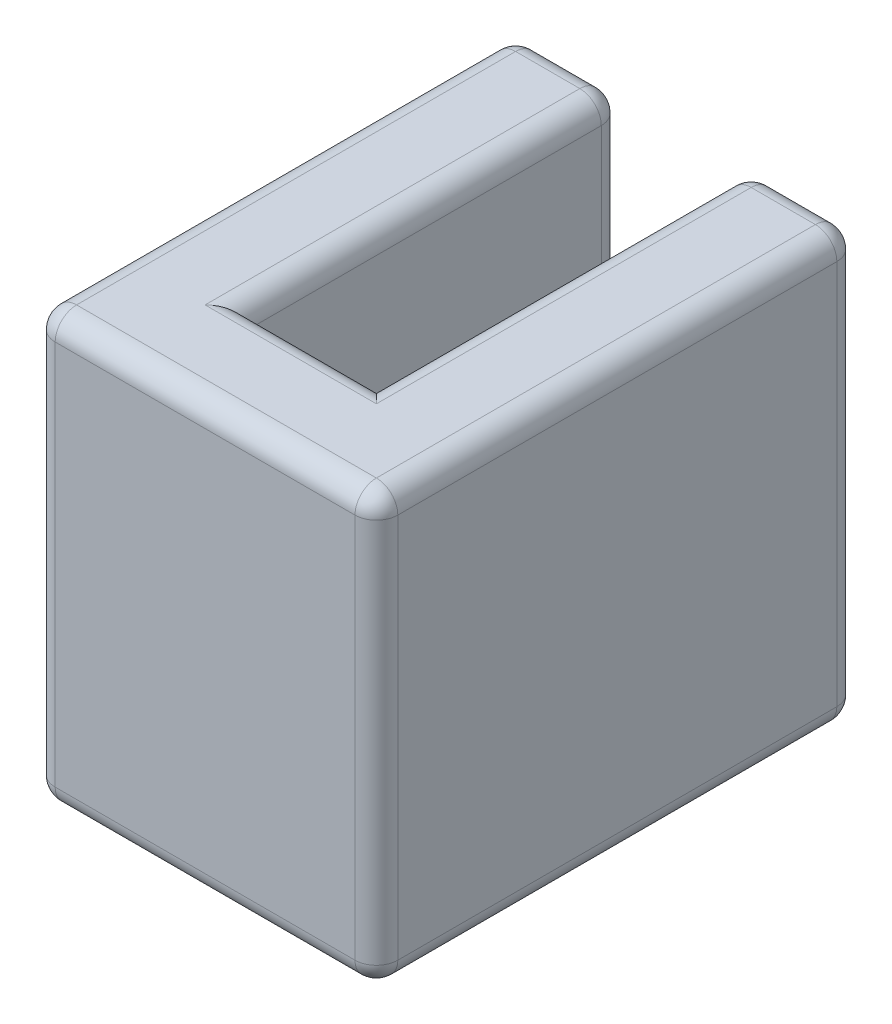
ISO-10303-21;
HEADER;
FILE_DESCRIPTION(('STEP AP214'),'2;1');
FILE_NAME('part.step','',(''),(''),'','','');
FILE_SCHEMA(('AUTOMOTIVE_DESIGN { 1 0 10303 214 1 1 1 1 }'));
ENDSEC;
DATA;
#1=APPLICATION_CONTEXT('core data for automotive mechanical design processes');
#2=APPLICATION_PROTOCOL_DEFINITION('international standard','automotive_design',2000,#1);
#3=PRODUCT_CONTEXT('',#1,'mechanical');
#4=PRODUCT('Part','Part','',(#3));
#5=PRODUCT_RELATED_PRODUCT_CATEGORY('part','',(#4));
#6=PRODUCT_DEFINITION_FORMATION('','',#4);
#7=PRODUCT_DEFINITION_CONTEXT('part definition',#1,'design');
#8=PRODUCT_DEFINITION('design','',#6,#7);
#9=PRODUCT_DEFINITION_SHAPE('','',#8);
#10=(LENGTH_UNIT() NAMED_UNIT(*) SI_UNIT(.MILLI.,.METRE.));
#11=(NAMED_UNIT(*) PLANE_ANGLE_UNIT() SI_UNIT($,.RADIAN.));
#12=(NAMED_UNIT(*) SI_UNIT($,.STERADIAN.) SOLID_ANGLE_UNIT());
#13=UNCERTAINTY_MEASURE_WITH_UNIT(LENGTH_MEASURE(1.E-05),#10,'distance_accuracy_value','');
#14=(GEOMETRIC_REPRESENTATION_CONTEXT(3) GLOBAL_UNCERTAINTY_ASSIGNED_CONTEXT((#13)) GLOBAL_UNIT_ASSIGNED_CONTEXT((#10,
#11,#12)) REPRESENTATION_CONTEXT('',''));
#15=CARTESIAN_POINT('',(0.,0.,0.));
#16=DIRECTION('',(0.,0.,1.));
#17=DIRECTION('',(1.,0.,0.));
#18=AXIS2_PLACEMENT_3D('',#15,#16,#17);
#19=CARTESIAN_POINT('',(0.,8.,-9.));
#20=DIRECTION('',(-1.,0.,0.));
#21=DIRECTION('',(0.,0.,1.));
#22=AXIS2_PLACEMENT_3D('',#19,#20,#21);
#23=PLANE('',#22);
#24=DIRECTION('',(0.,0.,-1.));
#25=VECTOR('',#24,1.);
#26=CARTESIAN_POINT('',(0.,0.4,-9.));
#27=LINE('',#26,#25);
#28=CARTESIAN_POINT('',(0.,0.4,-0.399999999999999));
#29=VERTEX_POINT('',#28);
#30=CARTESIAN_POINT('',(0.,0.4,-8.6));
#31=VERTEX_POINT('',#30);
#32=EDGE_CURVE('E317',#29,#31,#27,.T.);
#33=ORIENTED_EDGE('',*,*,#32,.T.);
#34=DIRECTION('',(0.,-1.,0.));
#35=VECTOR('',#34,1.);
#36=CARTESIAN_POINT('',(0.,8.,-8.6));
#37=LINE('',#36,#35);
#38=CARTESIAN_POINT('',(0.,7.6,-8.6));
#39=VERTEX_POINT('',#38);
#40=EDGE_CURVE('E320',#31,#39,#37,.F.);
#41=ORIENTED_EDGE('',*,*,#40,.T.);
#42=DIRECTION('',(0.,0.,-1.));
#43=VECTOR('',#42,1.);
#44=CARTESIAN_POINT('',(0.,7.6,-9.));
#45=LINE('',#44,#43);
#46=CARTESIAN_POINT('',(0.,7.6,-0.399999999999999));
#47=VERTEX_POINT('',#46);
#48=EDGE_CURVE('E311',#39,#47,#45,.F.);
#49=ORIENTED_EDGE('',*,*,#48,.T.);
#50=DIRECTION('',(0.,-1.,0.));
#51=VECTOR('',#50,1.);
#52=CARTESIAN_POINT('',(0.,8.,-0.399999999999999));
#53=LINE('',#52,#51);
#54=EDGE_CURVE('E314',#47,#29,#53,.T.);
#55=ORIENTED_EDGE('',*,*,#54,.T.);
#56=EDGE_LOOP('',(#33,#41,#49,#55));
#57=FACE_BOUND('',#56,.T.);
#58=ADVANCED_FACE('F39',(#57),#23,.F.);
#59=CARTESIAN_POINT('',(-2.,8.,-9.));
#60=DIRECTION('',(0.,0.,1.));
#61=DIRECTION('',(1.,0.,0.));
#62=AXIS2_PLACEMENT_3D('',#59,#60,#61);
#63=PLANE('',#62);
#64=DIRECTION('',(-1.,0.,0.));
#65=VECTOR('',#64,1.);
#66=CARTESIAN_POINT('',(-2.,0.4,-9.));
#67=LINE('',#66,#65);
#68=CARTESIAN_POINT('',(-0.400000000000001,0.4,-9.));
#69=VERTEX_POINT('',#68);
#70=CARTESIAN_POINT('',(-1.6,0.4,-9.));
#71=VERTEX_POINT('',#70);
#72=EDGE_CURVE('E304',#69,#71,#67,.T.);
#73=ORIENTED_EDGE('',*,*,#72,.T.);
#74=DIRECTION('',(0.,-1.,0.));
#75=VECTOR('',#74,1.);
#76=CARTESIAN_POINT('',(-1.6,8.,-9.));
#77=LINE('',#76,#75);
#78=CARTESIAN_POINT('',(-1.6,7.6,-9.));
#79=VERTEX_POINT('',#78);
#80=EDGE_CURVE('E307',#71,#79,#77,.F.);
#81=ORIENTED_EDGE('',*,*,#80,.T.);
#82=DIRECTION('',(-1.,0.,0.));
#83=VECTOR('',#82,1.);
#84=CARTESIAN_POINT('',(-2.,7.6,-9.));
#85=LINE('',#84,#83);
#86=CARTESIAN_POINT('',(-0.400000000000001,7.6,-9.));
#87=VERTEX_POINT('',#86);
#88=EDGE_CURVE('E298',#79,#87,#85,.F.);
#89=ORIENTED_EDGE('',*,*,#88,.T.);
#90=DIRECTION('',(0.,-1.,0.));
#91=VECTOR('',#90,1.);
#92=CARTESIAN_POINT('',(-0.400000000000001,8.,-9.));
#93=LINE('',#92,#91);
#94=EDGE_CURVE('E301',#87,#69,#93,.T.);
#95=ORIENTED_EDGE('',*,*,#94,.T.);
#96=EDGE_LOOP('',(#73,#81,#89,#95));
#97=FACE_BOUND('',#96,.T.);
#98=ADVANCED_FACE('F631',(#97),#63,.F.);
#99=CARTESIAN_POINT('',(-2.,8.,-2.));
#100=DIRECTION('',(1.,0.,0.));
#101=DIRECTION('',(0.,0.,-1.));
#102=AXIS2_PLACEMENT_3D('',#99,#100,#101);
#103=PLANE('',#102);
#104=DIRECTION('',(0.,-1.,0.));
#105=VECTOR('',#104,1.);
#106=CARTESIAN_POINT('',(-2.,8.,-8.6));
#107=LINE('',#106,#105);
#108=CARTESIAN_POINT('',(-2.,7.6,-8.6));
#109=VERTEX_POINT('',#108);
#110=CARTESIAN_POINT('',(-2.,0.4,-8.6));
#111=VERTEX_POINT('',#110);
#112=EDGE_CURVE('E229',#109,#111,#107,.T.);
#113=ORIENTED_EDGE('',*,*,#112,.T.);
#114=DIRECTION('',(0.,0.,1.));
#115=VECTOR('',#114,1.);
#116=CARTESIAN_POINT('',(-2.,0.4,-2.));
#117=LINE('',#116,#115);
#118=CARTESIAN_POINT('',(-2.,0.4,-2.));
#119=VERTEX_POINT('',#118);
#120=EDGE_CURVE('E210',#111,#119,#117,.T.);
#121=ORIENTED_EDGE('',*,*,#120,.T.);
#122=DIRECTION('',(0.,-1.,0.));
#123=VECTOR('',#122,1.);
#124=CARTESIAN_POINT('',(-2.,8.,-2.));
#125=LINE('',#124,#123);
#126=CARTESIAN_POINT('',(-2.,7.6,-2.));
#127=VERTEX_POINT('',#126);
#128=EDGE_CURVE('E192',#127,#119,#125,.T.);
#129=ORIENTED_EDGE('',*,*,#128,.F.);
#130=DIRECTION('',(0.,0.,1.));
#131=VECTOR('',#130,1.);
#132=CARTESIAN_POINT('',(-2.,7.6,-2.));
#133=LINE('',#132,#131);
#134=EDGE_CURVE('E207',#127,#109,#133,.F.);
#135=ORIENTED_EDGE('',*,*,#134,.T.);
#136=EDGE_LOOP('',(#113,#121,#129,#135));
#137=FACE_BOUND('',#136,.T.);
#138=ADVANCED_FACE('F205',(#137),#103,.F.);
#139=CARTESIAN_POINT('',(-4.4,8.,-2.));
#140=DIRECTION('',(0.,0.,1.));
#141=DIRECTION('',(1.,0.,0.));
#142=AXIS2_PLACEMENT_3D('',#139,#140,#141);
#143=PLANE('',#142);
#144=ORIENTED_EDGE('',*,*,#128,.T.);
#145=DIRECTION('',(-1.,0.,0.));
#146=VECTOR('',#145,1.);
#147=CARTESIAN_POINT('',(-4.4,0.4,-2.));
#148=LINE('',#147,#146);
#149=CARTESIAN_POINT('',(-4.4,0.4,-2.));
#150=VERTEX_POINT('',#149);
#151=EDGE_CURVE('E200',#119,#150,#148,.T.);
#152=ORIENTED_EDGE('',*,*,#151,.T.);
#153=DIRECTION('',(0.,-1.,0.));
#154=VECTOR('',#153,1.);
#155=CARTESIAN_POINT('',(-4.4,8.,-2.));
#156=LINE('',#155,#154);
#157=CARTESIAN_POINT('',(-4.4,7.6,-2.));
#158=VERTEX_POINT('',#157);
#159=EDGE_CURVE('E194',#158,#150,#156,.T.);
#160=ORIENTED_EDGE('',*,*,#159,.F.);
#161=DIRECTION('',(-1.,0.,0.));
#162=VECTOR('',#161,1.);
#163=CARTESIAN_POINT('',(-4.4,7.6,-2.));
#164=LINE('',#163,#162);
#165=EDGE_CURVE('E189',#158,#127,#164,.F.);
#166=ORIENTED_EDGE('',*,*,#165,.T.);
#167=EDGE_LOOP('',(#144,#152,#160,#166));
#168=FACE_BOUND('',#167,.T.);
#169=ADVANCED_FACE('F191',(#168),#143,.F.);
#170=CARTESIAN_POINT('',(-4.4,8.,-9.));
#171=DIRECTION('',(-1.,0.,0.));
#172=DIRECTION('',(0.,0.,1.));
#173=AXIS2_PLACEMENT_3D('',#170,#171,#172);
#174=PLANE('',#173);
#175=ORIENTED_EDGE('',*,*,#159,.T.);
#176=DIRECTION('',(0.,0.,-1.));
#177=VECTOR('',#176,1.);
#178=CARTESIAN_POINT('',(-4.4,0.4,-9.));
#179=LINE('',#178,#177);
#180=CARTESIAN_POINT('',(-4.4,0.4,-8.6));
#181=VERTEX_POINT('',#180);
#182=EDGE_CURVE('E269',#150,#181,#179,.T.);
#183=ORIENTED_EDGE('',*,*,#182,.T.);
#184=DIRECTION('',(0.,-1.,0.));
#185=VECTOR('',#184,1.);
#186=CARTESIAN_POINT('',(-4.4,8.,-8.6));
#187=LINE('',#186,#185);
#188=CARTESIAN_POINT('',(-4.4,7.6,-8.6));
#189=VERTEX_POINT('',#188);
#190=EDGE_CURVE('E266',#181,#189,#187,.F.);
#191=ORIENTED_EDGE('',*,*,#190,.T.);
#192=DIRECTION('',(0.,0.,-1.));
#193=VECTOR('',#192,1.);
#194=CARTESIAN_POINT('',(-4.4,7.6,-9.));
#195=LINE('',#194,#193);
#196=EDGE_CURVE('E263',#189,#158,#195,.F.);
#197=ORIENTED_EDGE('',*,*,#196,.T.);
#198=EDGE_LOOP('',(#175,#183,#191,#197));
#199=FACE_BOUND('',#198,.T.);
#200=ADVANCED_FACE('F506',(#199),#174,.F.);
#201=CARTESIAN_POINT('',(-6.4,8.,-9.));
#202=DIRECTION('',(0.,0.,1.));
#203=DIRECTION('',(1.,0.,0.));
#204=AXIS2_PLACEMENT_3D('',#201,#202,#203);
#205=PLANE('',#204);
#206=DIRECTION('',(0.,-1.,0.));
#207=VECTOR('',#206,1.);
#208=CARTESIAN_POINT('',(-4.8,8.,-9.));
#209=LINE('',#208,#207);
#210=CARTESIAN_POINT('',(-4.8,7.6,-9.));
#211=VERTEX_POINT('',#210);
#212=CARTESIAN_POINT('',(-4.8,0.4,-9.));
#213=VERTEX_POINT('',#212);
#214=EDGE_CURVE('E291',#211,#213,#209,.T.);
#215=ORIENTED_EDGE('',*,*,#214,.T.);
#216=DIRECTION('',(-1.,0.,0.));
#217=VECTOR('',#216,1.);
#218=CARTESIAN_POINT('',(-6.4,0.4,-9.));
#219=LINE('',#218,#217);
#220=CARTESIAN_POINT('',(-6.,0.4,-9.));
#221=VERTEX_POINT('',#220);
#222=EDGE_CURVE('E295',#213,#221,#219,.T.);
#223=ORIENTED_EDGE('',*,*,#222,.T.);
#224=DIRECTION('',(0.,-1.,0.));
#225=VECTOR('',#224,1.);
#226=CARTESIAN_POINT('',(-6.,8.,-9.));
#227=LINE('',#226,#225);
#228=CARTESIAN_POINT('',(-6.,7.6,-9.));
#229=VERTEX_POINT('',#228);
#230=EDGE_CURVE('E288',#221,#229,#227,.F.);
#231=ORIENTED_EDGE('',*,*,#230,.T.);
#232=DIRECTION('',(-1.,0.,0.));
#233=VECTOR('',#232,1.);
#234=CARTESIAN_POINT('',(-6.4,7.6,-9.));
#235=LINE('',#234,#233);
#236=EDGE_CURVE('E285',#229,#211,#235,.F.);
#237=ORIENTED_EDGE('',*,*,#236,.T.);
#238=EDGE_LOOP('',(#215,#223,#231,#237));
#239=FACE_BOUND('',#238,.T.);
#240=ADVANCED_FACE('F730',(#239),#205,.F.);
#241=CARTESIAN_POINT('',(-6.4,8.,0.));
#242=DIRECTION('',(1.,0.,0.));
#243=DIRECTION('',(0.,0.,-1.));
#244=AXIS2_PLACEMENT_3D('',#241,#242,#243);
#245=PLANE('',#244);
#246=DIRECTION('',(0.,-1.,0.));
#247=VECTOR('',#246,1.);
#248=CARTESIAN_POINT('',(-6.4,8.,-8.6));
#249=LINE('',#248,#247);
#250=CARTESIAN_POINT('',(-6.4,7.6,-8.6));
#251=VERTEX_POINT('',#250);
#252=CARTESIAN_POINT('',(-6.4,0.4,-8.6));
#253=VERTEX_POINT('',#252);
#254=EDGE_CURVE('E278',#251,#253,#249,.T.);
#255=ORIENTED_EDGE('',*,*,#254,.T.);
#256=DIRECTION('',(0.,0.,1.));
#257=VECTOR('',#256,1.);
#258=CARTESIAN_POINT('',(-6.4,0.4,0.));
#259=LINE('',#258,#257);
#260=CARTESIAN_POINT('',(-6.4,0.4,-0.399999999999999));
#261=VERTEX_POINT('',#260);
#262=EDGE_CURVE('E281',#253,#261,#259,.T.);
#263=ORIENTED_EDGE('',*,*,#262,.T.);
#264=DIRECTION('',(0.,-1.,0.));
#265=VECTOR('',#264,1.);
#266=CARTESIAN_POINT('',(-6.4,8.,-0.399999999999999));
#267=LINE('',#266,#265);
#268=CARTESIAN_POINT('',(-6.4,7.6,-0.399999999999999));
#269=VERTEX_POINT('',#268);
#270=EDGE_CURVE('E275',#261,#269,#267,.F.);
#271=ORIENTED_EDGE('',*,*,#270,.T.);
#272=DIRECTION('',(0.,0.,1.));
#273=VECTOR('',#272,1.);
#274=CARTESIAN_POINT('',(-6.4,7.6,0.));
#275=LINE('',#274,#273);
#276=EDGE_CURVE('E272',#269,#251,#275,.F.);
#277=ORIENTED_EDGE('',*,*,#276,.T.);
#278=EDGE_LOOP('',(#255,#263,#271,#277));
#279=FACE_BOUND('',#278,.T.);
#280=ADVANCED_FACE('F602',(#279),#245,.F.);
#281=CARTESIAN_POINT('',(0.,8.,0.));
#282=DIRECTION('',(0.,0.,-1.));
#283=DIRECTION('',(-1.,0.,0.));
#284=AXIS2_PLACEMENT_3D('',#281,#282,#283);
#285=PLANE('',#284);
#286=DIRECTION('',(0.,-1.,0.));
#287=VECTOR('',#286,1.);
#288=CARTESIAN_POINT('',(-6.,8.,0.));
#289=LINE('',#288,#287);
#290=CARTESIAN_POINT('',(-6.,7.6,0.));
#291=VERTEX_POINT('',#290);
#292=CARTESIAN_POINT('',(-6.,0.4,0.));
#293=VERTEX_POINT('',#292);
#294=EDGE_CURVE('E330',#291,#293,#289,.T.);
#295=ORIENTED_EDGE('',*,*,#294,.T.);
#296=DIRECTION('',(1.,0.,0.));
#297=VECTOR('',#296,1.);
#298=CARTESIAN_POINT('',(0.,0.4,0.));
#299=LINE('',#298,#297);
#300=CARTESIAN_POINT('',(-0.4,0.4,0.));
#301=VERTEX_POINT('',#300);
#302=EDGE_CURVE('E334',#293,#301,#299,.T.);
#303=ORIENTED_EDGE('',*,*,#302,.T.);
#304=DIRECTION('',(0.,-1.,0.));
#305=VECTOR('',#304,1.);
#306=CARTESIAN_POINT('',(-0.4,8.,0.));
#307=LINE('',#306,#305);
#308=CARTESIAN_POINT('',(-0.4,7.6,0.));
#309=VERTEX_POINT('',#308);
#310=EDGE_CURVE('E327',#301,#309,#307,.F.);
#311=ORIENTED_EDGE('',*,*,#310,.T.);
#312=DIRECTION('',(1.,0.,0.));
#313=VECTOR('',#312,1.);
#314=CARTESIAN_POINT('',(0.,7.6,0.));
#315=LINE('',#314,#313);
#316=EDGE_CURVE('E324',#309,#291,#315,.F.);
#317=ORIENTED_EDGE('',*,*,#316,.T.);
#318=EDGE_LOOP('',(#295,#303,#311,#317));
#319=FACE_BOUND('',#318,.T.);
#320=ADVANCED_FACE('F722',(#319),#285,.F.);
#321=CARTESIAN_POINT('',(0.,8.,0.));
#322=DIRECTION('',(0.,-1.,0.));
#323=DIRECTION('',(0.,0.,-1.));
#324=AXIS2_PLACEMENT_3D('',#321,#322,#323);
#325=PLANE('',#324);
#326=DIRECTION('',(0.,0.,1.));
#327=VECTOR('',#326,1.);
#328=CARTESIAN_POINT('',(-6.,8.,0.));
#329=LINE('',#328,#327);
#330=CARTESIAN_POINT('',(-6.,8.,-8.6));
#331=VERTEX_POINT('',#330);
#332=CARTESIAN_POINT('',(-6.,8.,-0.399999999999999));
#333=VERTEX_POINT('',#332);
#334=EDGE_CURVE('E49',#331,#333,#329,.T.);
#335=ORIENTED_EDGE('',*,*,#334,.T.);
#336=DIRECTION('',(1.,0.,0.));
#337=VECTOR('',#336,1.);
#338=CARTESIAN_POINT('',(0.,8.,-0.4));
#339=LINE('',#338,#337);
#340=CARTESIAN_POINT('',(-0.4,8.,-0.4));
#341=VERTEX_POINT('',#340);
#342=EDGE_CURVE('E11',#333,#341,#339,.T.);
#343=ORIENTED_EDGE('',*,*,#342,.T.);
#344=DIRECTION('',(0.,0.,-1.));
#345=VECTOR('',#344,1.);
#346=CARTESIAN_POINT('',(-0.4,8.,0.));
#347=LINE('',#346,#345);
#348=CARTESIAN_POINT('',(-0.400000000000001,8.,-8.6));
#349=VERTEX_POINT('',#348);
#350=EDGE_CURVE('E337',#341,#349,#347,.T.);
#351=ORIENTED_EDGE('',*,*,#350,.T.);
#352=DIRECTION('',(-1.,0.,0.));
#353=VECTOR('',#352,1.);
#354=CARTESIAN_POINT('',(0.,8.,-8.6));
#355=LINE('',#354,#353);
#356=CARTESIAN_POINT('',(-1.6,8.,-8.6));
#357=VERTEX_POINT('',#356);
#358=EDGE_CURVE('E340',#349,#357,#355,.T.);
#359=ORIENTED_EDGE('',*,*,#358,.T.);
#360=DIRECTION('',(0.,0.,1.));
#361=VECTOR('',#360,1.);
#362=CARTESIAN_POINT('',(-1.6,8.,0.));
#363=LINE('',#362,#361);
#364=CARTESIAN_POINT('',(-1.6,8.,-1.6));
#365=VERTEX_POINT('',#364);
#366=EDGE_CURVE('E343',#357,#365,#363,.T.);
#367=ORIENTED_EDGE('',*,*,#366,.T.);
#368=DIRECTION('',(-1.,0.,0.));
#369=VECTOR('',#368,1.);
#370=CARTESIAN_POINT('',(0.,8.,-1.6));
#371=LINE('',#370,#369);
#372=CARTESIAN_POINT('',(-4.8,8.,-1.6));
#373=VERTEX_POINT('',#372);
#374=EDGE_CURVE('E217',#365,#373,#371,.T.);
#375=ORIENTED_EDGE('',*,*,#374,.T.);
#376=DIRECTION('',(0.,0.,-1.));
#377=VECTOR('',#376,1.);
#378=CARTESIAN_POINT('',(-4.8,8.,0.));
#379=LINE('',#378,#377);
#380=CARTESIAN_POINT('',(-4.8,8.,-8.6));
#381=VERTEX_POINT('',#380);
#382=EDGE_CURVE('E348',#373,#381,#379,.T.);
#383=ORIENTED_EDGE('',*,*,#382,.T.);
#384=DIRECTION('',(-1.,0.,0.));
#385=VECTOR('',#384,1.);
#386=CARTESIAN_POINT('',(0.,8.,-8.6));
#387=LINE('',#386,#385);
#388=EDGE_CURVE('E60',#381,#331,#387,.T.);
#389=ORIENTED_EDGE('',*,*,#388,.T.);
#390=EDGE_LOOP('',(#335,#343,#351,#359,#367,#375,#383,#389));
#391=FACE_BOUND('',#390,.T.);
#392=ADVANCED_FACE('F611',(#391),#325,.F.);
#393=CARTESIAN_POINT('',(0.,0.,0.));
#394=DIRECTION('',(0.,-1.,0.));
#395=DIRECTION('',(0.,0.,-1.));
#396=AXIS2_PLACEMENT_3D('',#393,#394,#395);
#397=PLANE('',#396);
#398=DIRECTION('',(0.,0.,-1.));
#399=VECTOR('',#398,1.);
#400=CARTESIAN_POINT('',(-4.8,0.,-2.));
#401=LINE('',#400,#399);
#402=CARTESIAN_POINT('',(-4.8,0.,-8.6));
#403=VERTEX_POINT('',#402);
#404=CARTESIAN_POINT('',(-4.8,0.,-1.6));
#405=VERTEX_POINT('',#404);
#406=EDGE_CURVE('E256',#403,#405,#401,.F.);
#407=ORIENTED_EDGE('',*,*,#406,.T.);
#408=DIRECTION('',(-1.,0.,0.));
#409=VECTOR('',#408,1.);
#410=CARTESIAN_POINT('',(-2.,0.,-1.6));
#411=LINE('',#410,#409);
#412=CARTESIAN_POINT('',(-1.6,0.,-1.6));
#413=VERTEX_POINT('',#412);
#414=EDGE_CURVE('E201',#405,#413,#411,.F.);
#415=ORIENTED_EDGE('',*,*,#414,.T.);
#416=DIRECTION('',(0.,0.,1.));
#417=VECTOR('',#416,1.);
#418=CARTESIAN_POINT('',(-1.6,0.,-9.));
#419=LINE('',#418,#417);
#420=CARTESIAN_POINT('',(-1.6,0.,-8.6));
#421=VERTEX_POINT('',#420);
#422=EDGE_CURVE('E249',#413,#421,#419,.F.);
#423=ORIENTED_EDGE('',*,*,#422,.T.);
#424=DIRECTION('',(-1.,0.,0.));
#425=VECTOR('',#424,1.);
#426=CARTESIAN_POINT('',(0.,0.,-8.6));
#427=LINE('',#426,#425);
#428=CARTESIAN_POINT('',(-0.400000000000001,0.,-8.6));
#429=VERTEX_POINT('',#428);
#430=EDGE_CURVE('E243',#421,#429,#427,.F.);
#431=ORIENTED_EDGE('',*,*,#430,.T.);
#432=DIRECTION('',(0.,0.,-1.));
#433=VECTOR('',#432,1.);
#434=CARTESIAN_POINT('',(-0.4,0.,0.));
#435=LINE('',#434,#433);
#436=CARTESIAN_POINT('',(-0.4,0.,-0.4));
#437=VERTEX_POINT('',#436);
#438=EDGE_CURVE('E240',#429,#437,#435,.F.);
#439=ORIENTED_EDGE('',*,*,#438,.T.);
#440=DIRECTION('',(1.,0.,0.));
#441=VECTOR('',#440,1.);
#442=CARTESIAN_POINT('',(-6.4,0.,-0.399999999999999));
#443=LINE('',#442,#441);
#444=CARTESIAN_POINT('',(-6.,0.,-0.399999999999999));
#445=VERTEX_POINT('',#444);
#446=EDGE_CURVE('E237',#437,#445,#443,.F.);
#447=ORIENTED_EDGE('',*,*,#446,.T.);
#448=DIRECTION('',(0.,0.,1.));
#449=VECTOR('',#448,1.);
#450=CARTESIAN_POINT('',(-6.,0.,-9.));
#451=LINE('',#450,#449);
#452=CARTESIAN_POINT('',(-6.,0.,-8.6));
#453=VERTEX_POINT('',#452);
#454=EDGE_CURVE('E246',#445,#453,#451,.F.);
#455=ORIENTED_EDGE('',*,*,#454,.T.);
#456=DIRECTION('',(-1.,0.,0.));
#457=VECTOR('',#456,1.);
#458=CARTESIAN_POINT('',(-4.4,0.,-8.6));
#459=LINE('',#458,#457);
#460=EDGE_CURVE('E253',#453,#403,#459,.F.);
#461=ORIENTED_EDGE('',*,*,#460,.T.);
#462=EDGE_LOOP('',(#407,#415,#423,#431,#439,#447,#455,#461));
#463=FACE_BOUND('',#462,.T.);
#464=ADVANCED_FACE('F521',(#463),#397,.T.);
#465=CARTESIAN_POINT('',(-6.,7.6,-0.399999999999999));
#466=DIRECTION('',(0.,1.,0.));
#467=DIRECTION('',(0.,0.,1.));
#468=AXIS2_PLACEMENT_3D('',#465,#466,#467);
#469=SPHERICAL_SURFACE('',#468,0.4);
#470=CARTESIAN_POINT('',(-6.,7.6,-0.399999999999999));
#471=DIRECTION('',(0.,1.,0.));
#472=DIRECTION('',(0.,0.,1.));
#473=AXIS2_PLACEMENT_3D('',#470,#471,#472);
#474=CIRCLE('',#473,0.4);
#475=EDGE_CURVE('E488',#291,#269,#474,.F.);
#476=ORIENTED_EDGE('',*,*,#475,.F.);
#477=CARTESIAN_POINT('',(-6.,7.6,-0.399999999999999));
#478=DIRECTION('',(-1.,0.,0.));
#479=DIRECTION('',(0.,0.,1.));
#480=AXIS2_PLACEMENT_3D('',#477,#478,#479);
#481=CIRCLE('',#480,0.4);
#482=EDGE_CURVE('E43',#333,#291,#481,.F.);
#483=ORIENTED_EDGE('',*,*,#482,.F.);
#484=CARTESIAN_POINT('',(-6.,7.6,-0.399999999999999));
#485=DIRECTION('',(0.,0.,1.));
#486=DIRECTION('',(1.,0.,0.));
#487=AXIS2_PLACEMENT_3D('',#484,#485,#486);
#488=CIRCLE('',#487,0.4);
#489=EDGE_CURVE('E491',#269,#333,#488,.F.);
#490=ORIENTED_EDGE('',*,*,#489,.F.);
#491=EDGE_LOOP('',(#476,#483,#490));
#492=FACE_BOUND('',#491,.T.);
#493=ADVANCED_FACE('F41',(#492),#469,.T.);
#494=CARTESIAN_POINT('',(0.,7.6,-0.4));
#495=DIRECTION('',(1.,0.,0.));
#496=DIRECTION('',(0.,0.,-1.));
#497=AXIS2_PLACEMENT_3D('',#494,#495,#496);
#498=CYLINDRICAL_SURFACE('',#497,0.4);
#499=ORIENTED_EDGE('',*,*,#482,.T.);
#500=ORIENTED_EDGE('',*,*,#316,.F.);
#501=CARTESIAN_POINT('',(-0.4,7.6,-0.4));
#502=DIRECTION('',(1.,0.,0.));
#503=DIRECTION('',(0.,0.,-1.));
#504=AXIS2_PLACEMENT_3D('',#501,#502,#503);
#505=CIRCLE('',#504,0.4);
#506=EDGE_CURVE('E484',#341,#309,#505,.T.);
#507=ORIENTED_EDGE('',*,*,#506,.F.);
#508=ORIENTED_EDGE('',*,*,#342,.F.);
#509=EDGE_LOOP('',(#499,#500,#507,#508));
#510=FACE_BOUND('',#509,.T.);
#511=ADVANCED_FACE('F610',(#510),#498,.T.);
#512=CARTESIAN_POINT('',(-6.,7.6,0.));
#513=DIRECTION('',(0.,0.,1.));
#514=DIRECTION('',(1.,0.,0.));
#515=AXIS2_PLACEMENT_3D('',#512,#513,#514);
#516=CYLINDRICAL_SURFACE('',#515,0.4);
#517=ORIENTED_EDGE('',*,*,#489,.T.);
#518=ORIENTED_EDGE('',*,*,#334,.F.);
#519=CARTESIAN_POINT('',(-6.,7.6,-8.6));
#520=DIRECTION('',(0.,0.,-1.));
#521=DIRECTION('',(-1.,0.,0.));
#522=AXIS2_PLACEMENT_3D('',#519,#520,#521);
#523=CIRCLE('',#522,0.4);
#524=EDGE_CURVE('E480',#251,#331,#523,.T.);
#525=ORIENTED_EDGE('',*,*,#524,.F.);
#526=ORIENTED_EDGE('',*,*,#276,.F.);
#527=EDGE_LOOP('',(#517,#518,#525,#526));
#528=FACE_BOUND('',#527,.T.);
#529=ADVANCED_FACE('F600',(#528),#516,.T.);
#530=CARTESIAN_POINT('',(-6.,8.,-0.399999999999999));
#531=DIRECTION('',(0.,-1.,0.));
#532=DIRECTION('',(0.,0.,-1.));
#533=AXIS2_PLACEMENT_3D('',#530,#531,#532);
#534=CYLINDRICAL_SURFACE('',#533,0.4);
#535=ORIENTED_EDGE('',*,*,#475,.T.);
#536=ORIENTED_EDGE('',*,*,#270,.F.);
#537=CARTESIAN_POINT('',(-6.,0.4,-0.399999999999999));
#538=DIRECTION('',(0.,-1.,0.));
#539=DIRECTION('',(0.,0.,-1.));
#540=AXIS2_PLACEMENT_3D('',#537,#538,#539);
#541=CIRCLE('',#540,0.4);
#542=EDGE_CURVE('E476',#293,#261,#541,.T.);
#543=ORIENTED_EDGE('',*,*,#542,.F.);
#544=ORIENTED_EDGE('',*,*,#294,.F.);
#545=EDGE_LOOP('',(#535,#536,#543,#544));
#546=FACE_BOUND('',#545,.T.);
#547=ADVANCED_FACE('F607',(#546),#534,.T.);
#548=CARTESIAN_POINT('',(-0.4,7.6,-0.4));
#549=DIRECTION('',(0.,0.,1.));
#550=DIRECTION('',(1.,0.,0.));
#551=AXIS2_PLACEMENT_3D('',#548,#549,#550);
#552=SPHERICAL_SURFACE('',#551,0.4);
#553=CARTESIAN_POINT('',(-0.4,7.6,-0.399999999999999));
#554=DIRECTION('',(0.,0.,1.));
#555=DIRECTION('',(0.,-1.,0.));
#556=AXIS2_PLACEMENT_3D('',#553,#554,#555);
#557=CIRCLE('',#556,0.4);
#558=EDGE_CURVE('E464',#341,#47,#557,.F.);
#559=ORIENTED_EDGE('',*,*,#558,.F.);
#560=ORIENTED_EDGE('',*,*,#506,.T.);
#561=CARTESIAN_POINT('',(-0.4,7.6,-0.4));
#562=DIRECTION('',(0.,1.,0.));
#563=DIRECTION('',(0.,0.,1.));
#564=AXIS2_PLACEMENT_3D('',#561,#562,#563);
#565=CIRCLE('',#564,0.4);
#566=EDGE_CURVE('E468',#47,#309,#565,.F.);
#567=ORIENTED_EDGE('',*,*,#566,.F.);
#568=EDGE_LOOP('',(#559,#560,#567));
#569=FACE_BOUND('',#568,.T.);
#570=ADVANCED_FACE('F704',(#569),#552,.T.);
#571=CARTESIAN_POINT('',(-6.,7.6,-8.6));
#572=DIRECTION('',(0.,1.,0.));
#573=DIRECTION('',(0.,0.,1.));
#574=AXIS2_PLACEMENT_3D('',#571,#572,#573);
#575=SPHERICAL_SURFACE('',#574,0.4);
#576=CARTESIAN_POINT('',(-6.,7.6,-8.6));
#577=DIRECTION('',(0.,1.,0.));
#578=DIRECTION('',(0.,0.,1.));
#579=AXIS2_PLACEMENT_3D('',#576,#577,#578);
#580=CIRCLE('',#579,0.4);
#581=EDGE_CURVE('E456',#251,#229,#580,.F.);
#582=ORIENTED_EDGE('',*,*,#581,.F.);
#583=ORIENTED_EDGE('',*,*,#524,.T.);
#584=CARTESIAN_POINT('',(-6.,7.6,-8.6));
#585=DIRECTION('',(-1.,0.,0.));
#586=DIRECTION('',(0.,0.,1.));
#587=AXIS2_PLACEMENT_3D('',#584,#585,#586);
#588=CIRCLE('',#587,0.4);
#589=EDGE_CURVE('E460',#229,#331,#588,.F.);
#590=ORIENTED_EDGE('',*,*,#589,.F.);
#591=EDGE_LOOP('',(#582,#583,#590));
#592=FACE_BOUND('',#591,.T.);
#593=ADVANCED_FACE('F597',(#592),#575,.T.);
#594=CARTESIAN_POINT('',(-6.,0.4,-0.399999999999999));
#595=DIRECTION('',(0.,0.,1.));
#596=DIRECTION('',(0.,-1.,0.));
#597=AXIS2_PLACEMENT_3D('',#594,#595,#596);
#598=SPHERICAL_SURFACE('',#597,0.4);
#599=CARTESIAN_POINT('',(-6.,0.4,-0.399999999999999));
#600=DIRECTION('',(0.,0.,1.));
#601=DIRECTION('',(1.,0.,0.));
#602=AXIS2_PLACEMENT_3D('',#599,#600,#601);
#603=CIRCLE('',#602,0.4);
#604=EDGE_CURVE('E453',#445,#261,#603,.F.);
#605=ORIENTED_EDGE('',*,*,#604,.F.);
#606=CARTESIAN_POINT('',(-6.,0.4,-0.399999999999999));
#607=DIRECTION('',(-1.,0.,0.));
#608=DIRECTION('',(0.,0.,1.));
#609=AXIS2_PLACEMENT_3D('',#606,#607,#608);
#610=CIRCLE('',#609,0.4);
#611=EDGE_CURVE('E472',#293,#445,#610,.F.);
#612=ORIENTED_EDGE('',*,*,#611,.F.);
#613=ORIENTED_EDGE('',*,*,#542,.T.);
#614=EDGE_LOOP('',(#605,#612,#613));
#615=FACE_BOUND('',#614,.T.);
#616=ADVANCED_FACE('F698',(#615),#598,.T.);
#617=CARTESIAN_POINT('',(0.,0.4,-0.4));
#618=DIRECTION('',(-1.,0.,0.));
#619=DIRECTION('',(0.,0.,1.));
#620=AXIS2_PLACEMENT_3D('',#617,#618,#619);
#621=CYLINDRICAL_SURFACE('',#620,0.4);
#622=ORIENTED_EDGE('',*,*,#611,.T.);
#623=ORIENTED_EDGE('',*,*,#446,.F.);
#624=CARTESIAN_POINT('',(-0.4,0.4,-0.4));
#625=DIRECTION('',(1.,0.,0.));
#626=DIRECTION('',(0.,0.,-1.));
#627=AXIS2_PLACEMENT_3D('',#624,#625,#626);
#628=CIRCLE('',#627,0.4);
#629=EDGE_CURVE('E449',#301,#437,#628,.T.);
#630=ORIENTED_EDGE('',*,*,#629,.F.);
#631=ORIENTED_EDGE('',*,*,#302,.F.);
#632=EDGE_LOOP('',(#622,#623,#630,#631));
#633=FACE_BOUND('',#632,.T.);
#634=ADVANCED_FACE('F560',(#633),#621,.T.);
#635=CARTESIAN_POINT('',(-0.4,8.,-0.399999999999999));
#636=DIRECTION('',(0.,-1.,0.));
#637=DIRECTION('',(0.,0.,-1.));
#638=AXIS2_PLACEMENT_3D('',#635,#636,#637);
#639=CYLINDRICAL_SURFACE('',#638,0.4);
#640=ORIENTED_EDGE('',*,*,#566,.T.);
#641=ORIENTED_EDGE('',*,*,#310,.F.);
#642=CARTESIAN_POINT('',(-0.4,0.4,-0.399999999999999));
#643=DIRECTION('',(0.,-1.,0.));
#644=DIRECTION('',(0.,0.,-1.));
#645=AXIS2_PLACEMENT_3D('',#642,#643,#644);
#646=CIRCLE('',#645,0.4);
#647=EDGE_CURVE('E445',#29,#301,#646,.T.);
#648=ORIENTED_EDGE('',*,*,#647,.F.);
#649=ORIENTED_EDGE('',*,*,#54,.F.);
#650=EDGE_LOOP('',(#640,#641,#648,#649));
#651=FACE_BOUND('',#650,.T.);
#652=ADVANCED_FACE('F555',(#651),#639,.T.);
#653=CARTESIAN_POINT('',(-0.4,7.6,0.));
#654=DIRECTION('',(0.,0.,-1.));
#655=DIRECTION('',(-1.,0.,0.));
#656=AXIS2_PLACEMENT_3D('',#653,#654,#655);
#657=CYLINDRICAL_SURFACE('',#656,0.4);
#658=ORIENTED_EDGE('',*,*,#558,.T.);
#659=ORIENTED_EDGE('',*,*,#48,.F.);
#660=CARTESIAN_POINT('',(-0.400000000000001,7.6,-8.6));
#661=DIRECTION('',(0.,0.,-1.));
#662=DIRECTION('',(-1.,0.,0.));
#663=AXIS2_PLACEMENT_3D('',#660,#661,#662);
#664=CIRCLE('',#663,0.4);
#665=EDGE_CURVE('E441',#349,#39,#664,.T.);
#666=ORIENTED_EDGE('',*,*,#665,.F.);
#667=ORIENTED_EDGE('',*,*,#350,.F.);
#668=EDGE_LOOP('',(#658,#659,#666,#667));
#669=FACE_BOUND('',#668,.T.);
#670=ADVANCED_FACE('F617',(#669),#657,.T.);
#671=CARTESIAN_POINT('',(-4.8,7.6,0.));
#672=DIRECTION('',(0.,0.,-1.));
#673=DIRECTION('',(-1.,0.,0.));
#674=AXIS2_PLACEMENT_3D('',#671,#672,#673);
#675=CYLINDRICAL_SURFACE('',#674,0.4);
#676=CARTESIAN_POINT('',(-4.8,7.6,-8.6));
#677=DIRECTION('',(0.,0.,-1.));
#678=DIRECTION('',(-1.,0.,0.));
#679=AXIS2_PLACEMENT_3D('',#676,#677,#678);
#680=CIRCLE('',#679,0.4);
#681=EDGE_CURVE('E434',#381,#189,#680,.T.);
#682=ORIENTED_EDGE('',*,*,#681,.F.);
#683=ORIENTED_EDGE('',*,*,#382,.F.);
#684=CARTESIAN_POINT('',(-4.8,7.6,-1.6));
#685=DIRECTION('',(-0.707106781186548,0.,-0.707106781186547));
#686=DIRECTION('',(0.707106781186547,0.,-0.707106781186548));
#687=AXIS2_PLACEMENT_3D('',#684,#685,#686);
#688=ELLIPSE('',#687,0.565685424949238,0.4);
#689=EDGE_CURVE('E438',#158,#373,#688,.F.);
#690=ORIENTED_EDGE('',*,*,#689,.F.);
#691=ORIENTED_EDGE('',*,*,#196,.F.);
#692=EDGE_LOOP('',(#682,#683,#690,#691));
#693=FACE_BOUND('',#692,.T.);
#694=ADVANCED_FACE('F586',(#693),#675,.T.);
#695=CARTESIAN_POINT('',(0.,7.6,-8.6));
#696=DIRECTION('',(-1.,0.,0.));
#697=DIRECTION('',(0.,0.,1.));
#698=AXIS2_PLACEMENT_3D('',#695,#696,#697);
#699=CYLINDRICAL_SURFACE('',#698,0.4);
#700=ORIENTED_EDGE('',*,*,#589,.T.);
#701=ORIENTED_EDGE('',*,*,#388,.F.);
#702=CARTESIAN_POINT('',(-4.8,7.6,-8.6));
#703=DIRECTION('',(1.,0.,0.));
#704=DIRECTION('',(0.,0.,-1.));
#705=AXIS2_PLACEMENT_3D('',#702,#703,#704);
#706=CIRCLE('',#705,0.4);
#707=EDGE_CURVE('E430',#211,#381,#706,.T.);
#708=ORIENTED_EDGE('',*,*,#707,.F.);
#709=ORIENTED_EDGE('',*,*,#236,.F.);
#710=EDGE_LOOP('',(#700,#701,#708,#709));
#711=FACE_BOUND('',#710,.T.);
#712=ADVANCED_FACE('F593',(#711),#699,.T.);
#713=CARTESIAN_POINT('',(-6.,8.,-8.6));
#714=DIRECTION('',(0.,-1.,0.));
#715=DIRECTION('',(0.,0.,-1.));
#716=AXIS2_PLACEMENT_3D('',#713,#714,#715);
#717=CYLINDRICAL_SURFACE('',#716,0.4);
#718=ORIENTED_EDGE('',*,*,#581,.T.);
#719=ORIENTED_EDGE('',*,*,#230,.F.);
#720=CARTESIAN_POINT('',(-6.,0.4,-8.6));
#721=DIRECTION('',(0.,-1.,0.));
#722=DIRECTION('',(0.,0.,-1.));
#723=AXIS2_PLACEMENT_3D('',#720,#721,#722);
#724=CIRCLE('',#723,0.4);
#725=EDGE_CURVE('E426',#253,#221,#724,.T.);
#726=ORIENTED_EDGE('',*,*,#725,.F.);
#727=ORIENTED_EDGE('',*,*,#254,.F.);
#728=EDGE_LOOP('',(#718,#719,#726,#727));
#729=FACE_BOUND('',#728,.T.);
#730=ADVANCED_FACE('F684',(#729),#717,.T.);
#731=CARTESIAN_POINT('',(-6.,0.4,0.));
#732=DIRECTION('',(0.,0.,-1.));
#733=DIRECTION('',(-1.,0.,0.));
#734=AXIS2_PLACEMENT_3D('',#731,#732,#733);
#735=CYLINDRICAL_SURFACE('',#734,0.4);
#736=ORIENTED_EDGE('',*,*,#604,.T.);
#737=ORIENTED_EDGE('',*,*,#262,.F.);
#738=CARTESIAN_POINT('',(-6.,0.4,-8.6));
#739=DIRECTION('',(0.,0.,-1.));
#740=DIRECTION('',(-1.,0.,0.));
#741=AXIS2_PLACEMENT_3D('',#738,#739,#740);
#742=CIRCLE('',#741,0.4);
#743=EDGE_CURVE('E422',#453,#253,#742,.T.);
#744=ORIENTED_EDGE('',*,*,#743,.F.);
#745=ORIENTED_EDGE('',*,*,#454,.F.);
#746=EDGE_LOOP('',(#736,#737,#744,#745));
#747=FACE_BOUND('',#746,.T.);
#748=ADVANCED_FACE('F570',(#747),#735,.T.);
#749=CARTESIAN_POINT('',(-0.4,0.4,-0.4));
#750=DIRECTION('',(0.,0.,1.));
#751=DIRECTION('',(0.,-1.,0.));
#752=AXIS2_PLACEMENT_3D('',#749,#750,#751);
#753=SPHERICAL_SURFACE('',#752,0.4);
#754=ORIENTED_EDGE('',*,*,#647,.T.);
#755=ORIENTED_EDGE('',*,*,#629,.T.);
#756=CARTESIAN_POINT('',(-0.4,0.4,-0.4));
#757=DIRECTION('',(0.,0.,1.));
#758=DIRECTION('',(1.,0.,0.));
#759=AXIS2_PLACEMENT_3D('',#756,#757,#758);
#760=CIRCLE('',#759,0.4);
#761=EDGE_CURVE('E418',#29,#437,#760,.F.);
#762=ORIENTED_EDGE('',*,*,#761,.F.);
#763=EDGE_LOOP('',(#754,#755,#762));
#764=FACE_BOUND('',#763,.T.);
#765=ADVANCED_FACE('F558',(#764),#753,.T.);
#766=CARTESIAN_POINT('',(-0.400000000000001,7.6,-8.6));
#767=DIRECTION('',(1.,0.,0.));
#768=DIRECTION('',(0.,0.,-1.));
#769=AXIS2_PLACEMENT_3D('',#766,#767,#768);
#770=SPHERICAL_SURFACE('',#769,0.4);
#771=CARTESIAN_POINT('',(-0.400000000000001,7.6,-8.6));
#772=DIRECTION('',(1.,0.,0.));
#773=DIRECTION('',(0.,1.,0.));
#774=AXIS2_PLACEMENT_3D('',#771,#772,#773);
#775=CIRCLE('',#774,0.4);
#776=EDGE_CURVE('E221',#349,#87,#775,.F.);
#777=ORIENTED_EDGE('',*,*,#776,.F.);
#778=ORIENTED_EDGE('',*,*,#665,.T.);
#779=CARTESIAN_POINT('',(-0.400000000000001,7.6,-8.6));
#780=DIRECTION('',(0.,1.,0.));
#781=DIRECTION('',(0.,0.,1.));
#782=AXIS2_PLACEMENT_3D('',#779,#780,#781);
#783=CIRCLE('',#782,0.4);
#784=EDGE_CURVE('E415',#87,#39,#783,.F.);
#785=ORIENTED_EDGE('',*,*,#784,.F.);
#786=EDGE_LOOP('',(#777,#778,#785));
#787=FACE_BOUND('',#786,.T.);
#788=ADVANCED_FACE('F619',(#787),#770,.T.);
#789=CARTESIAN_POINT('',(0.,7.6,-1.6));
#790=DIRECTION('',(-1.,0.,0.));
#791=DIRECTION('',(0.,0.,1.));
#792=AXIS2_PLACEMENT_3D('',#789,#790,#791);
#793=CYLINDRICAL_SURFACE('',#792,0.4);
#794=ORIENTED_EDGE('',*,*,#689,.T.);
#795=ORIENTED_EDGE('',*,*,#374,.F.);
#796=CARTESIAN_POINT('',(-1.6,7.6,-1.6));
#797=DIRECTION('',(-0.707106781186547,0.,0.707106781186547));
#798=DIRECTION('',(-0.707106781186547,0.,-0.707106781186548));
#799=AXIS2_PLACEMENT_3D('',#796,#797,#798);
#800=ELLIPSE('',#799,0.565685424949238,0.4);
#801=EDGE_CURVE('E215',#127,#365,#800,.F.);
#802=ORIENTED_EDGE('',*,*,#801,.F.);
#803=ORIENTED_EDGE('',*,*,#165,.F.);
#804=EDGE_LOOP('',(#794,#795,#802,#803));
#805=FACE_BOUND('',#804,.T.);
#806=ADVANCED_FACE('F216',(#805),#793,.T.);
#807=CARTESIAN_POINT('',(-4.8,7.6,-8.6));
#808=DIRECTION('',(0.,1.,0.));
#809=DIRECTION('',(0.,0.,1.));
#810=AXIS2_PLACEMENT_3D('',#807,#808,#809);
#811=SPHERICAL_SURFACE('',#810,0.4);
#812=ORIENTED_EDGE('',*,*,#707,.T.);
#813=ORIENTED_EDGE('',*,*,#681,.T.);
#814=CARTESIAN_POINT('',(-4.8,7.6,-8.6));
#815=DIRECTION('',(0.,1.,0.));
#816=DIRECTION('',(0.,0.,1.));
#817=AXIS2_PLACEMENT_3D('',#814,#815,#816);
#818=CIRCLE('',#817,0.4);
#819=EDGE_CURVE('E222',#211,#189,#818,.F.);
#820=ORIENTED_EDGE('',*,*,#819,.F.);
#821=EDGE_LOOP('',(#812,#813,#820));
#822=FACE_BOUND('',#821,.T.);
#823=ADVANCED_FACE('F589',(#822),#811,.T.);
#824=CARTESIAN_POINT('',(-6.,0.4,-8.6));
#825=DIRECTION('',(-1.,0.,0.));
#826=DIRECTION('',(0.,-1.,0.));
#827=AXIS2_PLACEMENT_3D('',#824,#825,#826);
#828=SPHERICAL_SURFACE('',#827,0.4);
#829=ORIENTED_EDGE('',*,*,#743,.T.);
#830=ORIENTED_EDGE('',*,*,#725,.T.);
#831=CARTESIAN_POINT('',(-6.,0.4,-8.6));
#832=DIRECTION('',(-1.,0.,0.));
#833=DIRECTION('',(0.,0.,1.));
#834=AXIS2_PLACEMENT_3D('',#831,#832,#833);
#835=CIRCLE('',#834,0.4);
#836=EDGE_CURVE('E405',#453,#221,#835,.F.);
#837=ORIENTED_EDGE('',*,*,#836,.F.);
#838=EDGE_LOOP('',(#829,#830,#837));
#839=FACE_BOUND('',#838,.T.);
#840=ADVANCED_FACE('F573',(#839),#828,.T.);
#841=CARTESIAN_POINT('',(-0.400000000000001,0.4,-9.));
#842=DIRECTION('',(0.,0.,1.));
#843=DIRECTION('',(1.,0.,0.));
#844=AXIS2_PLACEMENT_3D('',#841,#842,#843);
#845=CYLINDRICAL_SURFACE('',#844,0.4);
#846=ORIENTED_EDGE('',*,*,#761,.T.);
#847=ORIENTED_EDGE('',*,*,#438,.F.);
#848=CARTESIAN_POINT('',(-0.400000000000001,0.4,-8.6));
#849=DIRECTION('',(0.,0.,-1.));
#850=DIRECTION('',(-1.,0.,0.));
#851=AXIS2_PLACEMENT_3D('',#848,#849,#850);
#852=CIRCLE('',#851,0.4);
#853=EDGE_CURVE('E401',#31,#429,#852,.T.);
#854=ORIENTED_EDGE('',*,*,#853,.F.);
#855=ORIENTED_EDGE('',*,*,#32,.F.);
#856=EDGE_LOOP('',(#846,#847,#854,#855));
#857=FACE_BOUND('',#856,.T.);
#858=ADVANCED_FACE('F538',(#857),#845,.T.);
#859=CARTESIAN_POINT('',(-0.400000000000001,8.,-8.6));
#860=DIRECTION('',(0.,-1.,0.));
#861=DIRECTION('',(0.,0.,-1.));
#862=AXIS2_PLACEMENT_3D('',#859,#860,#861);
#863=CYLINDRICAL_SURFACE('',#862,0.4);
#864=ORIENTED_EDGE('',*,*,#784,.T.);
#865=ORIENTED_EDGE('',*,*,#40,.F.);
#866=CARTESIAN_POINT('',(-0.400000000000001,0.4,-8.6));
#867=DIRECTION('',(0.,-1.,0.));
#868=DIRECTION('',(0.,0.,-1.));
#869=AXIS2_PLACEMENT_3D('',#866,#867,#868);
#870=CIRCLE('',#869,0.4);
#871=EDGE_CURVE('E397',#69,#31,#870,.T.);
#872=ORIENTED_EDGE('',*,*,#871,.F.);
#873=ORIENTED_EDGE('',*,*,#94,.F.);
#874=EDGE_LOOP('',(#864,#865,#872,#873));
#875=FACE_BOUND('',#874,.T.);
#876=ADVANCED_FACE('F547',(#875),#863,.T.);
#877=CARTESIAN_POINT('',(0.,7.6,-8.6));
#878=DIRECTION('',(-1.,0.,0.));
#879=DIRECTION('',(0.,0.,1.));
#880=AXIS2_PLACEMENT_3D('',#877,#878,#879);
#881=CYLINDRICAL_SURFACE('',#880,0.4);
#882=ORIENTED_EDGE('',*,*,#776,.T.);
#883=ORIENTED_EDGE('',*,*,#88,.F.);
#884=CARTESIAN_POINT('',(-1.6,7.6,-8.6));
#885=DIRECTION('',(-1.,0.,0.));
#886=DIRECTION('',(0.,0.,1.));
#887=AXIS2_PLACEMENT_3D('',#884,#885,#886);
#888=CIRCLE('',#887,0.4);
#889=EDGE_CURVE('E393',#357,#79,#888,.T.);
#890=ORIENTED_EDGE('',*,*,#889,.F.);
#891=ORIENTED_EDGE('',*,*,#358,.F.);
#892=EDGE_LOOP('',(#882,#883,#890,#891));
#893=FACE_BOUND('',#892,.T.);
#894=ADVANCED_FACE('F623',(#893),#881,.T.);
#895=CARTESIAN_POINT('',(-1.6,7.6,0.));
#896=DIRECTION('',(0.,0.,1.));
#897=DIRECTION('',(1.,0.,0.));
#898=AXIS2_PLACEMENT_3D('',#895,#896,#897);
#899=CYLINDRICAL_SURFACE('',#898,0.4);
#900=ORIENTED_EDGE('',*,*,#801,.T.);
#901=ORIENTED_EDGE('',*,*,#366,.F.);
#902=CARTESIAN_POINT('',(-1.6,7.6,-8.6));
#903=DIRECTION('',(0.,0.,-1.));
#904=DIRECTION('',(-1.,0.,0.));
#905=AXIS2_PLACEMENT_3D('',#902,#903,#904);
#906=CIRCLE('',#905,0.4);
#907=EDGE_CURVE('E226',#109,#357,#906,.T.);
#908=ORIENTED_EDGE('',*,*,#907,.F.);
#909=ORIENTED_EDGE('',*,*,#134,.F.);
#910=EDGE_LOOP('',(#900,#901,#908,#909));
#911=FACE_BOUND('',#910,.T.);
#912=ADVANCED_FACE('F224',(#911),#899,.T.);
#913=CARTESIAN_POINT('',(-4.8,8.,-8.6));
#914=DIRECTION('',(0.,-1.,0.));
#915=DIRECTION('',(0.,0.,-1.));
#916=AXIS2_PLACEMENT_3D('',#913,#914,#915);
#917=CYLINDRICAL_SURFACE('',#916,0.4);
#918=ORIENTED_EDGE('',*,*,#819,.T.);
#919=ORIENTED_EDGE('',*,*,#190,.F.);
#920=CARTESIAN_POINT('',(-4.8,0.4,-8.6));
#921=DIRECTION('',(0.,-1.,0.));
#922=DIRECTION('',(0.,0.,-1.));
#923=AXIS2_PLACEMENT_3D('',#920,#921,#922);
#924=CIRCLE('',#923,0.4);
#925=EDGE_CURVE('E387',#213,#181,#924,.T.);
#926=ORIENTED_EDGE('',*,*,#925,.F.);
#927=ORIENTED_EDGE('',*,*,#214,.F.);
#928=EDGE_LOOP('',(#918,#919,#926,#927));
#929=FACE_BOUND('',#928,.T.);
#930=ADVANCED_FACE('F582',(#929),#917,.T.);
#931=CARTESIAN_POINT('',(-6.4,0.4,-8.6));
#932=DIRECTION('',(1.,0.,0.));
#933=DIRECTION('',(0.,0.,-1.));
#934=AXIS2_PLACEMENT_3D('',#931,#932,#933);
#935=CYLINDRICAL_SURFACE('',#934,0.4);
#936=ORIENTED_EDGE('',*,*,#836,.T.);
#937=ORIENTED_EDGE('',*,*,#222,.F.);
#938=CARTESIAN_POINT('',(-4.8,0.4,-8.6));
#939=DIRECTION('',(1.,0.,0.));
#940=DIRECTION('',(0.,0.,-1.));
#941=AXIS2_PLACEMENT_3D('',#938,#939,#940);
#942=CIRCLE('',#941,0.4);
#943=EDGE_CURVE('E384',#403,#213,#942,.T.);
#944=ORIENTED_EDGE('',*,*,#943,.F.);
#945=ORIENTED_EDGE('',*,*,#460,.F.);
#946=EDGE_LOOP('',(#936,#937,#944,#945));
#947=FACE_BOUND('',#946,.T.);
#948=ADVANCED_FACE('F576',(#947),#935,.T.);
#949=CARTESIAN_POINT('',(-0.400000000000001,0.4,-8.6));
#950=DIRECTION('',(1.,0.,0.));
#951=DIRECTION('',(0.,1.,0.));
#952=AXIS2_PLACEMENT_3D('',#949,#950,#951);
#953=SPHERICAL_SURFACE('',#952,0.4);
#954=ORIENTED_EDGE('',*,*,#871,.T.);
#955=ORIENTED_EDGE('',*,*,#853,.T.);
#956=CARTESIAN_POINT('',(-0.400000000000001,0.4,-8.6));
#957=DIRECTION('',(1.,0.,0.));
#958=DIRECTION('',(0.,0.,-1.));
#959=AXIS2_PLACEMENT_3D('',#956,#957,#958);
#960=CIRCLE('',#959,0.4);
#961=EDGE_CURVE('E380',#69,#429,#960,.F.);
#962=ORIENTED_EDGE('',*,*,#961,.F.);
#963=EDGE_LOOP('',(#954,#955,#962));
#964=FACE_BOUND('',#963,.T.);
#965=ADVANCED_FACE('F542',(#964),#953,.T.);
#966=CARTESIAN_POINT('',(-1.6,7.6,-8.6));
#967=DIRECTION('',(0.,1.,0.));
#968=DIRECTION('',(0.,0.,1.));
#969=AXIS2_PLACEMENT_3D('',#966,#967,#968);
#970=SPHERICAL_SURFACE('',#969,0.4);
#971=ORIENTED_EDGE('',*,*,#907,.T.);
#972=ORIENTED_EDGE('',*,*,#889,.T.);
#973=CARTESIAN_POINT('',(-1.6,7.6,-8.6));
#974=DIRECTION('',(0.,1.,0.));
#975=DIRECTION('',(0.,0.,1.));
#976=AXIS2_PLACEMENT_3D('',#973,#974,#975);
#977=CIRCLE('',#976,0.4);
#978=EDGE_CURVE('E377',#109,#79,#977,.F.);
#979=ORIENTED_EDGE('',*,*,#978,.F.);
#980=EDGE_LOOP('',(#971,#972,#979));
#981=FACE_BOUND('',#980,.T.);
#982=ADVANCED_FACE('F625',(#981),#970,.T.);
#983=CARTESIAN_POINT('',(-4.8,0.4,-8.6));
#984=DIRECTION('',(0.,0.,-1.));
#985=DIRECTION('',(0.,1.,0.));
#986=AXIS2_PLACEMENT_3D('',#983,#984,#985);
#987=SPHERICAL_SURFACE('',#986,0.4);
#988=ORIENTED_EDGE('',*,*,#943,.T.);
#989=ORIENTED_EDGE('',*,*,#925,.T.);
#990=CARTESIAN_POINT('',(-4.8,0.4,-8.6));
#991=DIRECTION('',(0.,0.,-1.));
#992=DIRECTION('',(-1.,0.,0.));
#993=AXIS2_PLACEMENT_3D('',#990,#991,#992);
#994=CIRCLE('',#993,0.4);
#995=EDGE_CURVE('E373',#403,#181,#994,.F.);
#996=ORIENTED_EDGE('',*,*,#995,.F.);
#997=EDGE_LOOP('',(#988,#989,#996));
#998=FACE_BOUND('',#997,.T.);
#999=ADVANCED_FACE('F579',(#998),#987,.T.);
#1000=CARTESIAN_POINT('',(-2.,0.4,-8.6));
#1001=DIRECTION('',(1.,0.,0.));
#1002=DIRECTION('',(0.,0.,-1.));
#1003=AXIS2_PLACEMENT_3D('',#1000,#1001,#1002);
#1004=CYLINDRICAL_SURFACE('',#1003,0.4);
#1005=ORIENTED_EDGE('',*,*,#961,.T.);
#1006=ORIENTED_EDGE('',*,*,#430,.F.);
#1007=CARTESIAN_POINT('',(-1.6,0.4,-8.6));
#1008=DIRECTION('',(-1.,0.,0.));
#1009=DIRECTION('',(0.,0.,1.));
#1010=AXIS2_PLACEMENT_3D('',#1007,#1008,#1009);
#1011=CIRCLE('',#1010,0.4);
#1012=EDGE_CURVE('E369',#71,#421,#1011,.T.);
#1013=ORIENTED_EDGE('',*,*,#1012,.F.);
#1014=ORIENTED_EDGE('',*,*,#72,.F.);
#1015=EDGE_LOOP('',(#1005,#1006,#1013,#1014));
#1016=FACE_BOUND('',#1015,.T.);
#1017=ADVANCED_FACE('F532',(#1016),#1004,.T.);
#1018=CARTESIAN_POINT('',(-1.6,8.,-8.6));
#1019=DIRECTION('',(0.,-1.,0.));
#1020=DIRECTION('',(0.,0.,-1.));
#1021=AXIS2_PLACEMENT_3D('',#1018,#1019,#1020);
#1022=CYLINDRICAL_SURFACE('',#1021,0.4);
#1023=ORIENTED_EDGE('',*,*,#978,.T.);
#1024=ORIENTED_EDGE('',*,*,#80,.F.);
#1025=CARTESIAN_POINT('',(-1.6,0.4,-8.6));
#1026=DIRECTION('',(0.,-1.,0.));
#1027=DIRECTION('',(0.,0.,-1.));
#1028=AXIS2_PLACEMENT_3D('',#1025,#1026,#1027);
#1029=CIRCLE('',#1028,0.4);
#1030=EDGE_CURVE('E365',#111,#71,#1029,.T.);
#1031=ORIENTED_EDGE('',*,*,#1030,.F.);
#1032=ORIENTED_EDGE('',*,*,#112,.F.);
#1033=EDGE_LOOP('',(#1023,#1024,#1031,#1032));
#1034=FACE_BOUND('',#1033,.T.);
#1035=ADVANCED_FACE('F629',(#1034),#1022,.T.);
#1036=CARTESIAN_POINT('',(-4.8,0.4,-9.));
#1037=DIRECTION('',(0.,0.,1.));
#1038=DIRECTION('',(1.,0.,0.));
#1039=AXIS2_PLACEMENT_3D('',#1036,#1037,#1038);
#1040=CYLINDRICAL_SURFACE('',#1039,0.4);
#1041=ORIENTED_EDGE('',*,*,#995,.T.);
#1042=ORIENTED_EDGE('',*,*,#182,.F.);
#1043=CARTESIAN_POINT('',(-4.8,0.4,-1.6));
#1044=DIRECTION('',(0.707106781186548,0.,0.707106781186547));
#1045=DIRECTION('',(0.707106781186547,0.,-0.707106781186548));
#1046=AXIS2_PLACEMENT_3D('',#1043,#1044,#1045);
#1047=ELLIPSE('',#1046,0.565685424949238,0.4);
#1048=EDGE_CURVE('E361',#405,#150,#1047,.T.);
#1049=ORIENTED_EDGE('',*,*,#1048,.F.);
#1050=ORIENTED_EDGE('',*,*,#406,.F.);
#1051=EDGE_LOOP('',(#1041,#1042,#1049,#1050));
#1052=FACE_BOUND('',#1051,.T.);
#1053=ADVANCED_FACE('F511',(#1052),#1040,.T.);
#1054=CARTESIAN_POINT('',(-1.6,0.4,-8.6));
#1055=DIRECTION('',(0.,0.,-1.));
#1056=DIRECTION('',(0.,1.,0.));
#1057=AXIS2_PLACEMENT_3D('',#1054,#1055,#1056);
#1058=SPHERICAL_SURFACE('',#1057,0.4);
#1059=ORIENTED_EDGE('',*,*,#1030,.T.);
#1060=ORIENTED_EDGE('',*,*,#1012,.T.);
#1061=CARTESIAN_POINT('',(-1.6,0.4,-8.6));
#1062=DIRECTION('',(0.,0.,-1.));
#1063=DIRECTION('',(-1.,0.,0.));
#1064=AXIS2_PLACEMENT_3D('',#1061,#1062,#1063);
#1065=CIRCLE('',#1064,0.4);
#1066=EDGE_CURVE('E358',#111,#421,#1065,.F.);
#1067=ORIENTED_EDGE('',*,*,#1066,.F.);
#1068=EDGE_LOOP('',(#1059,#1060,#1067));
#1069=FACE_BOUND('',#1068,.T.);
#1070=ADVANCED_FACE('F528',(#1069),#1058,.T.);
#1071=CARTESIAN_POINT('',(-4.4,0.4,-1.6));
#1072=DIRECTION('',(1.,0.,0.));
#1073=DIRECTION('',(0.,0.,-1.));
#1074=AXIS2_PLACEMENT_3D('',#1071,#1072,#1073);
#1075=CYLINDRICAL_SURFACE('',#1074,0.4);
#1076=ORIENTED_EDGE('',*,*,#1048,.T.);
#1077=ORIENTED_EDGE('',*,*,#151,.F.);
#1078=CARTESIAN_POINT('',(-1.6,0.4,-1.6));
#1079=DIRECTION('',(0.707106781186547,0.,-0.707106781186547));
#1080=DIRECTION('',(-0.707106781186547,0.,-0.707106781186548));
#1081=AXIS2_PLACEMENT_3D('',#1078,#1079,#1080);
#1082=ELLIPSE('',#1081,0.565685424949238,0.4);
#1083=EDGE_CURVE('E355',#413,#119,#1082,.T.);
#1084=ORIENTED_EDGE('',*,*,#1083,.F.);
#1085=ORIENTED_EDGE('',*,*,#414,.F.);
#1086=EDGE_LOOP('',(#1076,#1077,#1084,#1085));
#1087=FACE_BOUND('',#1086,.T.);
#1088=ADVANCED_FACE('F517',(#1087),#1075,.T.);
#1089=CARTESIAN_POINT('',(-1.6,0.4,-2.));
#1090=DIRECTION('',(0.,0.,-1.));
#1091=DIRECTION('',(-1.,0.,0.));
#1092=AXIS2_PLACEMENT_3D('',#1089,#1090,#1091);
#1093=CYLINDRICAL_SURFACE('',#1092,0.4);
#1094=ORIENTED_EDGE('',*,*,#1066,.T.);
#1095=ORIENTED_EDGE('',*,*,#422,.F.);
#1096=ORIENTED_EDGE('',*,*,#1083,.T.);
#1097=ORIENTED_EDGE('',*,*,#120,.F.);
#1098=EDGE_LOOP('',(#1094,#1095,#1096,#1097));
#1099=FACE_BOUND('',#1098,.T.);
#1100=ADVANCED_FACE('F523',(#1099),#1093,.T.);
#1101=CLOSED_SHELL('',(#58,#98,#138,#169,#200,#240,#280,#320,#392,#464,#493,#511,#529,#547,#570,
#593,#616,#634,#652,#670,#694,#712,#730,#748,#765,#788,#806,#823,#840,#858,#876,#894,#912,#930,
#948,#965,#982,#999,#1017,#1035,#1053,#1070,#1088,#1100));
#1102=MANIFOLD_SOLID_BREP('B2',#1101);
#1103=ADVANCED_BREP_SHAPE_REPRESENTATION('',(#18,#1102),#14);
#1104=SHAPE_DEFINITION_REPRESENTATION(#9,#1103);
ENDSEC;
END-ISO-10303-21;
